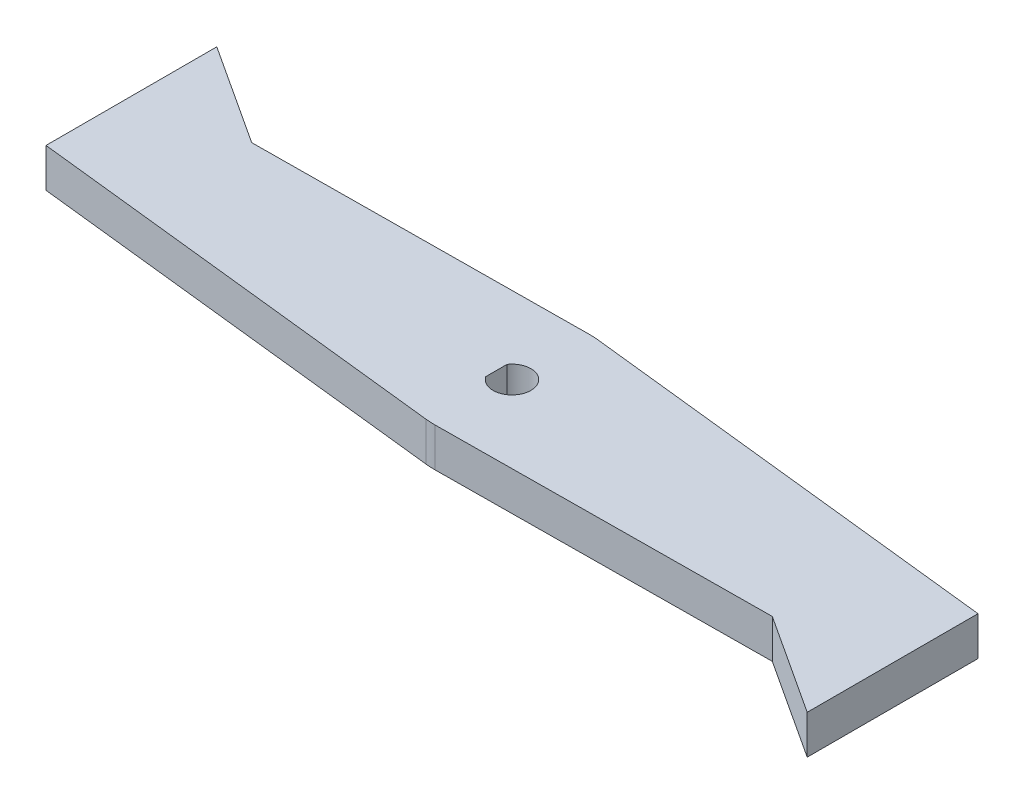
ISO-10303-21;
HEADER;
FILE_DESCRIPTION(('STEP AP214'),'2;1');
FILE_NAME('part.step','',(''),(''),'','','');
FILE_SCHEMA(('AUTOMOTIVE_DESIGN { 1 0 10303 214 1 1 1 1 }'));
ENDSEC;
DATA;
#1=APPLICATION_CONTEXT('core data for automotive mechanical design processes');
#2=APPLICATION_PROTOCOL_DEFINITION('international standard','automotive_design',2000,#1);
#3=PRODUCT_CONTEXT('',#1,'mechanical');
#4=PRODUCT('Part','Part','',(#3));
#5=PRODUCT_RELATED_PRODUCT_CATEGORY('part','',(#4));
#6=PRODUCT_DEFINITION_FORMATION('','',#4);
#7=PRODUCT_DEFINITION_CONTEXT('part definition',#1,'design');
#8=PRODUCT_DEFINITION('design','',#6,#7);
#9=PRODUCT_DEFINITION_SHAPE('','',#8);
#10=(LENGTH_UNIT() NAMED_UNIT(*) SI_UNIT(.MILLI.,.METRE.));
#11=(NAMED_UNIT(*) PLANE_ANGLE_UNIT() SI_UNIT($,.RADIAN.));
#12=(NAMED_UNIT(*) SI_UNIT($,.STERADIAN.) SOLID_ANGLE_UNIT());
#13=UNCERTAINTY_MEASURE_WITH_UNIT(LENGTH_MEASURE(1.E-05),#10,'distance_accuracy_value','');
#14=(GEOMETRIC_REPRESENTATION_CONTEXT(3) GLOBAL_UNCERTAINTY_ASSIGNED_CONTEXT((#13)) GLOBAL_UNIT_ASSIGNED_CONTEXT((#10,
#11,#12)) REPRESENTATION_CONTEXT('',''));
#15=CARTESIAN_POINT('',(0.,0.,0.));
#16=DIRECTION('',(0.,0.,1.));
#17=DIRECTION('',(1.,0.,0.));
#18=AXIS2_PLACEMENT_3D('',#15,#16,#17);
#19=CARTESIAN_POINT('',(0.,6.35,0.));
#20=DIRECTION('',(0.,1.,0.));
#21=DIRECTION('',(0.,0.,1.));
#22=AXIS2_PLACEMENT_3D('',#19,#20,#21);
#23=PLANE('',#22);
#24=DIRECTION('',(-0.993976351672746,0.,-0.109594764087237));
#25=VECTOR('',#24,1.);
#26=CARTESIAN_POINT('',(71.12,6.35,-4.9353491859843));
#27=LINE('',#26,#25);
#28=CARTESIAN_POINT('',(71.12,6.35,-4.9353491859843));
#29=VERTEX_POINT('',#28);
#30=CARTESIAN_POINT('',(1.39185350390791,6.35,-12.6234996662439));
#31=VERTEX_POINT('',#30);
#32=EDGE_CURVE('E183',#29,#31,#27,.T.);
#33=ORIENTED_EDGE('',*,*,#32,.T.);
#34=CARTESIAN_POINT('',(0.,6.35,0.));
#35=DIRECTION('',(0.,1.,0.));
#36=DIRECTION('',(0.,0.,1.));
#37=AXIS2_PLACEMENT_3D('',#34,#35,#36);
#38=CIRCLE('',#37,12.7);
#39=CARTESIAN_POINT('',(-0.106224527458475,6.35,-12.699555754032));
#40=VERTEX_POINT('',#39);
#41=EDGE_CURVE('E275',#31,#40,#38,.T.);
#42=ORIENTED_EDGE('',*,*,#41,.T.);
#43=DIRECTION('',(-0.999965020002516,0.,0.00836413602035104));
#44=VECTOR('',#43,1.);
#45=CARTESIAN_POINT('',(-54.7257733691201,6.35,-12.2426944371424));
#46=LINE('',#45,#44);
#47=CARTESIAN_POINT('',(-54.7257733691201,6.35,-12.2426944371424));
#48=VERTEX_POINT('',#47);
#49=EDGE_CURVE('E213',#40,#48,#46,.T.);
#50=ORIENTED_EDGE('',*,*,#49,.T.);
#51=DIRECTION('',(-0.837510554553811,0.,-0.546421148026839));
#52=VECTOR('',#51,1.);
#53=CARTESIAN_POINT('',(-71.12,6.35,-22.9388606979128));
#54=LINE('',#53,#52);
#55=CARTESIAN_POINT('',(-71.12,6.35,-22.9388606979128));
#56=VERTEX_POINT('',#55);
#57=EDGE_CURVE('E235',#48,#56,#54,.T.);
#58=ORIENTED_EDGE('',*,*,#57,.T.);
#59=DIRECTION('',(0.,0.,1.));
#60=VECTOR('',#59,1.);
#61=CARTESIAN_POINT('',(-71.12,6.35,4.93534918598423));
#62=LINE('',#61,#60);
#63=CARTESIAN_POINT('',(-71.12,6.35,4.93534918598423));
#64=VERTEX_POINT('',#63);
#65=EDGE_CURVE('E230',#56,#64,#62,.T.);
#66=ORIENTED_EDGE('',*,*,#65,.T.);
#67=DIRECTION('',(0.993976351672746,0.,0.109594764087238));
#68=VECTOR('',#67,1.);
#69=CARTESIAN_POINT('',(-71.12,6.35,4.93534918598423));
#70=LINE('',#69,#68);
#71=CARTESIAN_POINT('',(-1.39185350390792,6.35,12.6234996662439));
#72=VERTEX_POINT('',#71);
#73=EDGE_CURVE('E234',#64,#72,#70,.T.);
#74=ORIENTED_EDGE('',*,*,#73,.T.);
#75=CARTESIAN_POINT('',(0.,6.35,0.));
#76=DIRECTION('',(0.,1.,0.));
#77=DIRECTION('',(0.,0.,1.));
#78=AXIS2_PLACEMENT_3D('',#75,#76,#77);
#79=CIRCLE('',#78,12.7);
#80=CARTESIAN_POINT('',(0.106224527458471,6.35,12.699555754032));
#81=VERTEX_POINT('',#80);
#82=EDGE_CURVE('E239',#72,#81,#79,.T.);
#83=ORIENTED_EDGE('',*,*,#82,.T.);
#84=DIRECTION('',(0.999965020002516,0.,-0.00836413602035205));
#85=VECTOR('',#84,1.);
#86=CARTESIAN_POINT('',(54.7257733691201,6.35,12.2426944371423));
#87=LINE('',#86,#85);
#88=CARTESIAN_POINT('',(54.7257733691201,6.35,12.2426944371423));
#89=VERTEX_POINT('',#88);
#90=EDGE_CURVE('E254',#81,#89,#87,.T.);
#91=ORIENTED_EDGE('',*,*,#90,.T.);
#92=DIRECTION('',(0.837510554553811,0.,0.546421148026838));
#93=VECTOR('',#92,1.);
#94=CARTESIAN_POINT('',(71.12,6.35,22.9388606979127));
#95=LINE('',#94,#93);
#96=CARTESIAN_POINT('',(71.12,6.35,22.9388606979127));
#97=VERTEX_POINT('',#96);
#98=EDGE_CURVE('E159',#89,#97,#95,.T.);
#99=ORIENTED_EDGE('',*,*,#98,.T.);
#100=DIRECTION('',(0.,0.,-1.));
#101=VECTOR('',#100,1.);
#102=CARTESIAN_POINT('',(71.12,6.35,-4.9353491859843));
#103=LINE('',#102,#101);
#104=EDGE_CURVE('E154',#97,#29,#103,.T.);
#105=ORIENTED_EDGE('',*,*,#104,.T.);
#106=EDGE_LOOP('',(#33,#42,#50,#58,#66,#74,#83,#91,#99,#105));
#107=FACE_BOUND('',#106,.T.);
#108=DIRECTION('',(0.,0.,1.));
#109=VECTOR('',#108,1.);
#110=CARTESIAN_POINT('',(-2.5527,6.35,-1.73428253753534));
#111=LINE('',#110,#109);
#112=CARTESIAN_POINT('',(-2.5527,6.35,-1.73428253753534));
#113=VERTEX_POINT('',#112);
#114=CARTESIAN_POINT('',(-2.5527,6.35,1.73428253753534));
#115=VERTEX_POINT('',#114);
#116=EDGE_CURVE('E132',#113,#115,#111,.T.);
#117=ORIENTED_EDGE('',*,*,#116,.F.);
#118=CARTESIAN_POINT('',(0.,6.35,0.));
#119=DIRECTION('',(0.,1.,0.));
#120=DIRECTION('',(0.,0.,1.));
#121=AXIS2_PLACEMENT_3D('',#118,#119,#120);
#122=CIRCLE('',#121,3.0861);
#123=EDGE_CURVE('E139',#115,#113,#122,.T.);
#124=ORIENTED_EDGE('',*,*,#123,.F.);
#125=EDGE_LOOP('',(#117,#124));
#126=FACE_BOUND('',#125,.T.);
#127=ADVANCED_FACE('F44',(#107,#126),#23,.T.);
#128=CARTESIAN_POINT('',(0.,0.,0.));
#129=DIRECTION('',(0.,1.,0.));
#130=DIRECTION('',(0.,0.,1.));
#131=AXIS2_PLACEMENT_3D('',#128,#129,#130);
#132=PLANE('',#131);
#133=DIRECTION('',(-0.993976351672746,0.,-0.109594764087237));
#134=VECTOR('',#133,1.);
#135=CARTESIAN_POINT('',(71.12,0.,-4.9353491859843));
#136=LINE('',#135,#134);
#137=CARTESIAN_POINT('',(71.12,0.,-4.9353491859843));
#138=VERTEX_POINT('',#137);
#139=CARTESIAN_POINT('',(1.39185350390791,0.,-12.6234996662439));
#140=VERTEX_POINT('',#139);
#141=EDGE_CURVE('E162',#138,#140,#136,.T.);
#142=ORIENTED_EDGE('',*,*,#141,.F.);
#143=DIRECTION('',(0.,0.,-1.));
#144=VECTOR('',#143,1.);
#145=CARTESIAN_POINT('',(71.12,0.,-4.9353491859843));
#146=LINE('',#145,#144);
#147=CARTESIAN_POINT('',(71.12,0.,22.9388606979127));
#148=VERTEX_POINT('',#147);
#149=EDGE_CURVE('E181',#148,#138,#146,.T.);
#150=ORIENTED_EDGE('',*,*,#149,.F.);
#151=DIRECTION('',(0.837510554553811,0.,0.546421148026838));
#152=VECTOR('',#151,1.);
#153=CARTESIAN_POINT('',(71.12,0.,22.9388606979127));
#154=LINE('',#153,#152);
#155=CARTESIAN_POINT('',(54.7257733691201,0.,12.2426944371423));
#156=VERTEX_POINT('',#155);
#157=EDGE_CURVE('E179',#156,#148,#154,.T.);
#158=ORIENTED_EDGE('',*,*,#157,.F.);
#159=DIRECTION('',(0.999965020002516,0.,-0.00836413602035205));
#160=VECTOR('',#159,1.);
#161=CARTESIAN_POINT('',(54.7257733691201,0.,12.2426944371423));
#162=LINE('',#161,#160);
#163=CARTESIAN_POINT('',(0.106224527458471,0.,12.699555754032));
#164=VERTEX_POINT('',#163);
#165=EDGE_CURVE('E177',#164,#156,#162,.T.);
#166=ORIENTED_EDGE('',*,*,#165,.F.);
#167=CARTESIAN_POINT('',(0.,0.,0.));
#168=DIRECTION('',(0.,1.,0.));
#169=DIRECTION('',(0.,0.,1.));
#170=AXIS2_PLACEMENT_3D('',#167,#168,#169);
#171=CIRCLE('',#170,12.7);
#172=CARTESIAN_POINT('',(-1.39185350390792,0.,12.6234996662439));
#173=VERTEX_POINT('',#172);
#174=EDGE_CURVE('E175',#173,#164,#171,.T.);
#175=ORIENTED_EDGE('',*,*,#174,.F.);
#176=DIRECTION('',(0.993976351672746,0.,0.109594764087238));
#177=VECTOR('',#176,1.);
#178=CARTESIAN_POINT('',(-71.12,0.,4.93534918598423));
#179=LINE('',#178,#177);
#180=CARTESIAN_POINT('',(-71.12,0.,4.93534918598423));
#181=VERTEX_POINT('',#180);
#182=EDGE_CURVE('E173',#181,#173,#179,.T.);
#183=ORIENTED_EDGE('',*,*,#182,.F.);
#184=DIRECTION('',(0.,0.,1.));
#185=VECTOR('',#184,1.);
#186=CARTESIAN_POINT('',(-71.12,0.,4.93534918598423));
#187=LINE('',#186,#185);
#188=CARTESIAN_POINT('',(-71.12,0.,-22.9388606979128));
#189=VERTEX_POINT('',#188);
#190=EDGE_CURVE('E171',#189,#181,#187,.T.);
#191=ORIENTED_EDGE('',*,*,#190,.F.);
#192=DIRECTION('',(-0.837510554553811,0.,-0.546421148026839));
#193=VECTOR('',#192,1.);
#194=CARTESIAN_POINT('',(-71.12,0.,-22.9388606979128));
#195=LINE('',#194,#193);
#196=CARTESIAN_POINT('',(-54.7257733691201,0.,-12.2426944371424));
#197=VERTEX_POINT('',#196);
#198=EDGE_CURVE('E169',#197,#189,#195,.T.);
#199=ORIENTED_EDGE('',*,*,#198,.F.);
#200=DIRECTION('',(-0.999965020002516,0.,0.00836413602035104));
#201=VECTOR('',#200,1.);
#202=CARTESIAN_POINT('',(-54.7257733691201,0.,-12.2426944371424));
#203=LINE('',#202,#201);
#204=CARTESIAN_POINT('',(-0.106224527458475,0.,-12.699555754032));
#205=VERTEX_POINT('',#204);
#206=EDGE_CURVE('E167',#205,#197,#203,.T.);
#207=ORIENTED_EDGE('',*,*,#206,.F.);
#208=CARTESIAN_POINT('',(0.,0.,0.));
#209=DIRECTION('',(0.,1.,0.));
#210=DIRECTION('',(0.,0.,1.));
#211=AXIS2_PLACEMENT_3D('',#208,#209,#210);
#212=CIRCLE('',#211,12.7);
#213=EDGE_CURVE('E165',#140,#205,#212,.T.);
#214=ORIENTED_EDGE('',*,*,#213,.F.);
#215=EDGE_LOOP('',(#142,#150,#158,#166,#175,#183,#191,#199,#207,#214));
#216=FACE_BOUND('',#215,.T.);
#217=CARTESIAN_POINT('',(0.,0.,0.));
#218=DIRECTION('',(0.,1.,0.));
#219=DIRECTION('',(0.,0.,1.));
#220=AXIS2_PLACEMENT_3D('',#217,#218,#219);
#221=CIRCLE('',#220,3.0861);
#222=CARTESIAN_POINT('',(-2.5527,0.,1.73428253753534));
#223=VERTEX_POINT('',#222);
#224=CARTESIAN_POINT('',(-2.5527,0.,-1.73428253753534));
#225=VERTEX_POINT('',#224);
#226=EDGE_CURVE('E66',#223,#225,#221,.T.);
#227=ORIENTED_EDGE('',*,*,#226,.T.);
#228=DIRECTION('',(0.,0.,1.));
#229=VECTOR('',#228,1.);
#230=CARTESIAN_POINT('',(-2.5527,0.,-1.73428253753534));
#231=LINE('',#230,#229);
#232=EDGE_CURVE('E144',#225,#223,#231,.T.);
#233=ORIENTED_EDGE('',*,*,#232,.T.);
#234=EDGE_LOOP('',(#227,#233));
#235=FACE_BOUND('',#234,.T.);
#236=ADVANCED_FACE('F218',(#216,#235),#132,.F.);
#237=CARTESIAN_POINT('',(71.12,6.35,-4.9353491859843));
#238=DIRECTION('',(-0.109594764087236,0.,0.993976351672746));
#239=DIRECTION('',(0.993976351672746,0.,0.109594764087236));
#240=AXIS2_PLACEMENT_3D('',#237,#238,#239);
#241=PLANE('',#240);
#242=ORIENTED_EDGE('',*,*,#141,.T.);
#243=DIRECTION('',(0.,-1.,0.));
#244=VECTOR('',#243,1.);
#245=CARTESIAN_POINT('',(1.39185350390791,6.35,-12.6234996662439));
#246=LINE('',#245,#244);
#247=EDGE_CURVE('E12',#31,#140,#246,.T.);
#248=ORIENTED_EDGE('',*,*,#247,.F.);
#249=ORIENTED_EDGE('',*,*,#32,.F.);
#250=DIRECTION('',(0.,-1.,0.));
#251=VECTOR('',#250,1.);
#252=CARTESIAN_POINT('',(71.12,6.35,-4.9353491859843));
#253=LINE('',#252,#251);
#254=EDGE_CURVE('E158',#29,#138,#253,.T.);
#255=ORIENTED_EDGE('',*,*,#254,.T.);
#256=EDGE_LOOP('',(#242,#248,#249,#255));
#257=FACE_BOUND('',#256,.T.);
#258=ADVANCED_FACE('F46',(#257),#241,.F.);
#259=CARTESIAN_POINT('',(0.,6.35,0.));
#260=DIRECTION('',(0.,-1.,0.));
#261=DIRECTION('',(0.,0.,-1.));
#262=AXIS2_PLACEMENT_3D('',#259,#260,#261);
#263=CYLINDRICAL_SURFACE('',#262,12.7);
#264=ORIENTED_EDGE('',*,*,#213,.T.);
#265=DIRECTION('',(0.,-1.,0.));
#266=VECTOR('',#265,1.);
#267=CARTESIAN_POINT('',(-0.106224527458475,6.35,-12.699555754032));
#268=LINE('',#267,#266);
#269=EDGE_CURVE('E52',#40,#205,#268,.T.);
#270=ORIENTED_EDGE('',*,*,#269,.F.);
#271=ORIENTED_EDGE('',*,*,#41,.F.);
#272=ORIENTED_EDGE('',*,*,#247,.T.);
#273=EDGE_LOOP('',(#264,#270,#271,#272));
#274=FACE_BOUND('',#273,.T.);
#275=ADVANCED_FACE('F286',(#274),#263,.T.);
#276=CARTESIAN_POINT('',(-54.7257733691201,6.35,-12.2426944371424));
#277=DIRECTION('',(0.00836413602035104,0.,0.999965020002516));
#278=DIRECTION('',(0.999965020002516,0.,-0.00836413602035104));
#279=AXIS2_PLACEMENT_3D('',#276,#277,#278);
#280=PLANE('',#279);
#281=ORIENTED_EDGE('',*,*,#206,.T.);
#282=DIRECTION('',(0.,-1.,0.));
#283=VECTOR('',#282,1.);
#284=CARTESIAN_POINT('',(-54.7257733691201,6.35,-12.2426944371424));
#285=LINE('',#284,#283);
#286=EDGE_CURVE('E204',#48,#197,#285,.T.);
#287=ORIENTED_EDGE('',*,*,#286,.F.);
#288=ORIENTED_EDGE('',*,*,#49,.F.);
#289=ORIENTED_EDGE('',*,*,#269,.T.);
#290=EDGE_LOOP('',(#281,#287,#288,#289));
#291=FACE_BOUND('',#290,.T.);
#292=ADVANCED_FACE('F211',(#291),#280,.F.);
#293=CARTESIAN_POINT('',(-71.12,6.35,-22.9388606979128));
#294=DIRECTION('',(-0.546421148026839,0.,0.837510554553811));
#295=DIRECTION('',(0.837510554553811,0.,0.546421148026839));
#296=AXIS2_PLACEMENT_3D('',#293,#294,#295);
#297=PLANE('',#296);
#298=ORIENTED_EDGE('',*,*,#198,.T.);
#299=DIRECTION('',(0.,-1.,0.));
#300=VECTOR('',#299,1.);
#301=CARTESIAN_POINT('',(-71.12,6.35,-22.9388606979128));
#302=LINE('',#301,#300);
#303=EDGE_CURVE('E201',#56,#189,#302,.T.);
#304=ORIENTED_EDGE('',*,*,#303,.F.);
#305=ORIENTED_EDGE('',*,*,#57,.F.);
#306=ORIENTED_EDGE('',*,*,#286,.T.);
#307=EDGE_LOOP('',(#298,#304,#305,#306));
#308=FACE_BOUND('',#307,.T.);
#309=ADVANCED_FACE('F224',(#308),#297,.F.);
#310=CARTESIAN_POINT('',(-71.12,6.35,4.93534918598423));
#311=DIRECTION('',(1.,0.,0.));
#312=DIRECTION('',(0.,0.,-1.));
#313=AXIS2_PLACEMENT_3D('',#310,#311,#312);
#314=PLANE('',#313);
#315=ORIENTED_EDGE('',*,*,#190,.T.);
#316=DIRECTION('',(0.,-1.,0.));
#317=VECTOR('',#316,1.);
#318=CARTESIAN_POINT('',(-71.12,6.35,4.93534918598423));
#319=LINE('',#318,#317);
#320=EDGE_CURVE('E198',#64,#181,#319,.T.);
#321=ORIENTED_EDGE('',*,*,#320,.F.);
#322=ORIENTED_EDGE('',*,*,#65,.F.);
#323=ORIENTED_EDGE('',*,*,#303,.T.);
#324=EDGE_LOOP('',(#315,#321,#322,#323));
#325=FACE_BOUND('',#324,.T.);
#326=ADVANCED_FACE('F228',(#325),#314,.F.);
#327=CARTESIAN_POINT('',(-71.12,6.35,4.93534918598423));
#328=DIRECTION('',(0.109594764087238,0.,-0.993976351672746));
#329=DIRECTION('',(-0.993976351672746,0.,-0.109594764087238));
#330=AXIS2_PLACEMENT_3D('',#327,#328,#329);
#331=PLANE('',#330);
#332=ORIENTED_EDGE('',*,*,#182,.T.);
#333=DIRECTION('',(0.,-1.,0.));
#334=VECTOR('',#333,1.);
#335=CARTESIAN_POINT('',(-1.39185350390792,6.35,12.6234996662439));
#336=LINE('',#335,#334);
#337=EDGE_CURVE('E195',#72,#173,#336,.T.);
#338=ORIENTED_EDGE('',*,*,#337,.F.);
#339=ORIENTED_EDGE('',*,*,#73,.F.);
#340=ORIENTED_EDGE('',*,*,#320,.T.);
#341=EDGE_LOOP('',(#332,#338,#339,#340));
#342=FACE_BOUND('',#341,.T.);
#343=ADVANCED_FACE('F297',(#342),#331,.F.);
#344=CARTESIAN_POINT('',(0.,6.35,0.));
#345=DIRECTION('',(0.,-1.,0.));
#346=DIRECTION('',(0.,0.,-1.));
#347=AXIS2_PLACEMENT_3D('',#344,#345,#346);
#348=CYLINDRICAL_SURFACE('',#347,12.7);
#349=ORIENTED_EDGE('',*,*,#174,.T.);
#350=DIRECTION('',(0.,-1.,0.));
#351=VECTOR('',#350,1.);
#352=CARTESIAN_POINT('',(0.106224527458471,6.35,12.699555754032));
#353=LINE('',#352,#351);
#354=EDGE_CURVE('E192',#81,#164,#353,.T.);
#355=ORIENTED_EDGE('',*,*,#354,.F.);
#356=ORIENTED_EDGE('',*,*,#82,.F.);
#357=ORIENTED_EDGE('',*,*,#337,.T.);
#358=EDGE_LOOP('',(#349,#355,#356,#357));
#359=FACE_BOUND('',#358,.T.);
#360=ADVANCED_FACE('F294',(#359),#348,.T.);
#361=CARTESIAN_POINT('',(54.7257733691201,6.35,12.2426944371423));
#362=DIRECTION('',(-0.00836413602035205,0.,-0.999965020002516));
#363=DIRECTION('',(-0.999965020002516,0.,0.00836413602035205));
#364=AXIS2_PLACEMENT_3D('',#361,#362,#363);
#365=PLANE('',#364);
#366=ORIENTED_EDGE('',*,*,#165,.T.);
#367=DIRECTION('',(0.,-1.,0.));
#368=VECTOR('',#367,1.);
#369=CARTESIAN_POINT('',(54.7257733691201,6.35,12.2426944371423));
#370=LINE('',#369,#368);
#371=EDGE_CURVE('E189',#89,#156,#370,.T.);
#372=ORIENTED_EDGE('',*,*,#371,.F.);
#373=ORIENTED_EDGE('',*,*,#90,.F.);
#374=ORIENTED_EDGE('',*,*,#354,.T.);
#375=EDGE_LOOP('',(#366,#372,#373,#374));
#376=FACE_BOUND('',#375,.T.);
#377=ADVANCED_FACE('F290',(#376),#365,.F.);
#378=CARTESIAN_POINT('',(71.12,6.35,22.9388606979127));
#379=DIRECTION('',(0.546421148026838,0.,-0.837510554553811));
#380=DIRECTION('',(-0.837510554553811,0.,-0.546421148026838));
#381=AXIS2_PLACEMENT_3D('',#378,#379,#380);
#382=PLANE('',#381);
#383=ORIENTED_EDGE('',*,*,#157,.T.);
#384=DIRECTION('',(0.,-1.,0.));
#385=VECTOR('',#384,1.);
#386=CARTESIAN_POINT('',(71.12,6.35,22.9388606979127));
#387=LINE('',#386,#385);
#388=EDGE_CURVE('E186',#97,#148,#387,.T.);
#389=ORIENTED_EDGE('',*,*,#388,.F.);
#390=ORIENTED_EDGE('',*,*,#98,.F.);
#391=ORIENTED_EDGE('',*,*,#371,.T.);
#392=EDGE_LOOP('',(#383,#389,#390,#391));
#393=FACE_BOUND('',#392,.T.);
#394=ADVANCED_FACE('F266',(#393),#382,.F.);
#395=CARTESIAN_POINT('',(71.12,6.35,-4.9353491859843));
#396=DIRECTION('',(-1.,0.,0.));
#397=DIRECTION('',(0.,0.,1.));
#398=AXIS2_PLACEMENT_3D('',#395,#396,#397);
#399=PLANE('',#398);
#400=ORIENTED_EDGE('',*,*,#149,.T.);
#401=ORIENTED_EDGE('',*,*,#254,.F.);
#402=ORIENTED_EDGE('',*,*,#104,.F.);
#403=ORIENTED_EDGE('',*,*,#388,.T.);
#404=EDGE_LOOP('',(#400,#401,#402,#403));
#405=FACE_BOUND('',#404,.T.);
#406=ADVANCED_FACE('F270',(#405),#399,.F.);
#407=CARTESIAN_POINT('',(0.,6.35,0.));
#408=DIRECTION('',(0.,-1.,0.));
#409=DIRECTION('',(0.,0.,-1.));
#410=AXIS2_PLACEMENT_3D('',#407,#408,#409);
#411=CYLINDRICAL_SURFACE('',#410,3.0861);
#412=ORIENTED_EDGE('',*,*,#226,.F.);
#413=DIRECTION('',(0.,-1.,0.));
#414=VECTOR('',#413,1.);
#415=CARTESIAN_POINT('',(-2.5527,6.35,1.73428253753534));
#416=LINE('',#415,#414);
#417=EDGE_CURVE('E134',#115,#223,#416,.T.);
#418=ORIENTED_EDGE('',*,*,#417,.F.);
#419=ORIENTED_EDGE('',*,*,#123,.T.);
#420=DIRECTION('',(0.,-1.,0.));
#421=VECTOR('',#420,1.);
#422=CARTESIAN_POINT('',(-2.5527,6.35,-1.73428253753534));
#423=LINE('',#422,#421);
#424=EDGE_CURVE('E59',#113,#225,#423,.T.);
#425=ORIENTED_EDGE('',*,*,#424,.T.);
#426=EDGE_LOOP('',(#412,#418,#419,#425));
#427=FACE_BOUND('',#426,.T.);
#428=ADVANCED_FACE('F141',(#427),#411,.F.);
#429=CARTESIAN_POINT('',(-2.5527,6.35,-1.73428253753534));
#430=DIRECTION('',(1.,0.,0.));
#431=DIRECTION('',(0.,0.,-1.));
#432=AXIS2_PLACEMENT_3D('',#429,#430,#431);
#433=PLANE('',#432);
#434=ORIENTED_EDGE('',*,*,#232,.F.);
#435=ORIENTED_EDGE('',*,*,#424,.F.);
#436=ORIENTED_EDGE('',*,*,#116,.T.);
#437=ORIENTED_EDGE('',*,*,#417,.T.);
#438=EDGE_LOOP('',(#434,#435,#436,#437));
#439=FACE_BOUND('',#438,.T.);
#440=ADVANCED_FACE('F133',(#439),#433,.T.);
#441=CLOSED_SHELL('',(#127,#236,#258,#275,#292,#309,#326,#343,#360,#377,#394,#406,#428,#440));
#442=MANIFOLD_SOLID_BREP('B2',#441);
#443=ADVANCED_BREP_SHAPE_REPRESENTATION('',(#18,#442),#14);
#444=SHAPE_DEFINITION_REPRESENTATION(#9,#443);
ENDSEC;
END-ISO-10303-21;
